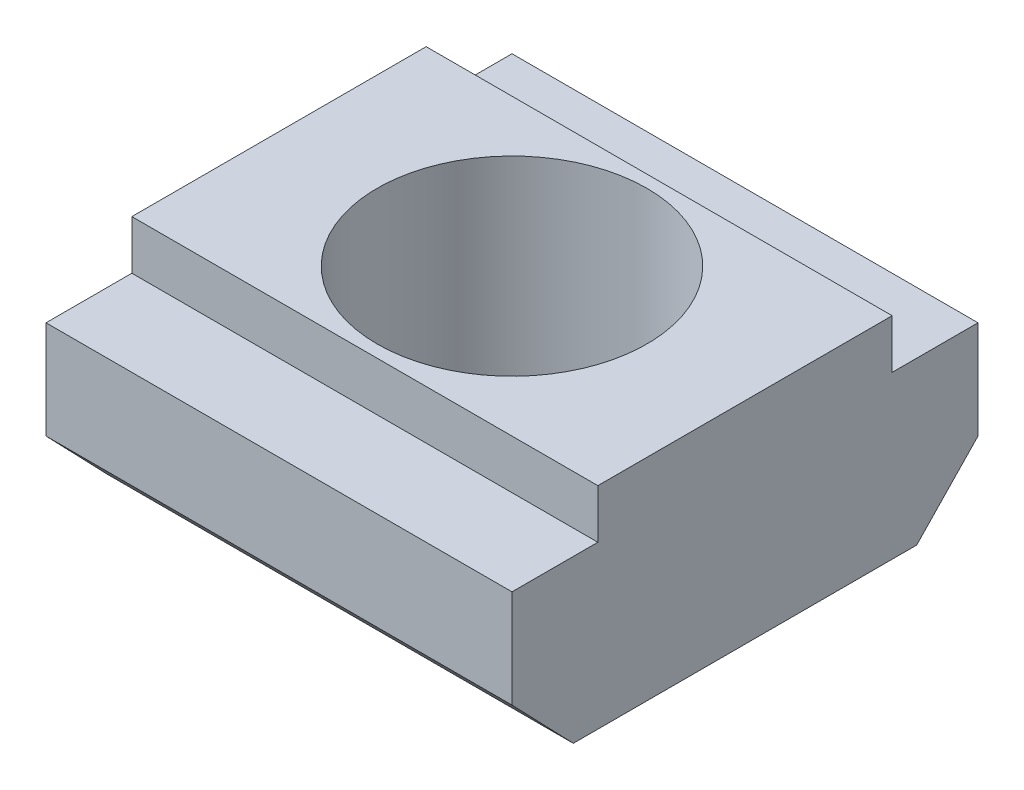
ISO-10303-21;
HEADER;
FILE_DESCRIPTION(('STEP AP214'),'2;1');
FILE_NAME('part.step','',(''),(''),'','','');
FILE_SCHEMA(('AUTOMOTIVE_DESIGN { 1 0 10303 214 1 1 1 1 }'));
ENDSEC;
DATA;
#1=APPLICATION_CONTEXT('core data for automotive mechanical design processes');
#2=APPLICATION_PROTOCOL_DEFINITION('international standard','automotive_design',2000,#1);
#3=PRODUCT_CONTEXT('',#1,'mechanical');
#4=PRODUCT('Part','Part','',(#3));
#5=PRODUCT_RELATED_PRODUCT_CATEGORY('part','',(#4));
#6=PRODUCT_DEFINITION_FORMATION('','',#4);
#7=PRODUCT_DEFINITION_CONTEXT('part definition',#1,'design');
#8=PRODUCT_DEFINITION('design','',#6,#7);
#9=PRODUCT_DEFINITION_SHAPE('','',#8);
#10=(LENGTH_UNIT() NAMED_UNIT(*) SI_UNIT(.MILLI.,.METRE.));
#11=(NAMED_UNIT(*) PLANE_ANGLE_UNIT() SI_UNIT($,.RADIAN.));
#12=(NAMED_UNIT(*) SI_UNIT($,.STERADIAN.) SOLID_ANGLE_UNIT());
#13=UNCERTAINTY_MEASURE_WITH_UNIT(LENGTH_MEASURE(1.E-05),#10,'distance_accuracy_value','');
#14=(GEOMETRIC_REPRESENTATION_CONTEXT(3) GLOBAL_UNCERTAINTY_ASSIGNED_CONTEXT((#13)) GLOBAL_UNIT_ASSIGNED_CONTEXT((#10,
#11,#12)) REPRESENTATION_CONTEXT('',''));
#15=CARTESIAN_POINT('',(0.,0.,0.));
#16=DIRECTION('',(0.,0.,1.));
#17=DIRECTION('',(1.,0.,0.));
#18=AXIS2_PLACEMENT_3D('',#15,#16,#17);
#19=CARTESIAN_POINT('',(4.75,0.,-3.5));
#20=DIRECTION('',(0.,0.693108716251784,0.720833064901856));
#21=DIRECTION('',(0.,-0.720833064901856,0.693108716251784));
#22=AXIS2_PLACEMENT_3D('',#19,#20,#21);
#23=PLANE('',#22);
#24=DIRECTION('',(0.,0.720833064901856,-0.693108716251784));
#25=VECTOR('',#24,1.);
#26=CARTESIAN_POINT('',(-4.75,0.,-3.5));
#27=LINE('',#26,#25);
#28=CARTESIAN_POINT('',(-4.75,0.,-3.5));
#29=VERTEX_POINT('',#28);
#30=CARTESIAN_POINT('',(-4.75,1.3,-4.75));
#31=VERTEX_POINT('',#30);
#32=EDGE_CURVE('E141',#29,#31,#27,.T.);
#33=ORIENTED_EDGE('',*,*,#32,.T.);
#34=DIRECTION('',(-1.,0.,0.));
#35=VECTOR('',#34,1.);
#36=CARTESIAN_POINT('',(4.75,1.3,-4.75));
#37=LINE('',#36,#35);
#38=CARTESIAN_POINT('',(4.75,1.3,-4.75));
#39=VERTEX_POINT('',#38);
#40=EDGE_CURVE('E11',#39,#31,#37,.T.);
#41=ORIENTED_EDGE('',*,*,#40,.F.);
#42=DIRECTION('',(0.,0.720833064901856,-0.693108716251784));
#43=VECTOR('',#42,1.);
#44=CARTESIAN_POINT('',(4.75,0.,-3.5));
#45=LINE('',#44,#43);
#46=CARTESIAN_POINT('',(4.75,0.,-3.5));
#47=VERTEX_POINT('',#46);
#48=EDGE_CURVE('E160',#47,#39,#45,.T.);
#49=ORIENTED_EDGE('',*,*,#48,.F.);
#50=DIRECTION('',(-1.,0.,0.));
#51=VECTOR('',#50,1.);
#52=CARTESIAN_POINT('',(4.75,0.,-3.5));
#53=LINE('',#52,#51);
#54=EDGE_CURVE('E137',#47,#29,#53,.T.);
#55=ORIENTED_EDGE('',*,*,#54,.T.);
#56=EDGE_LOOP('',(#33,#41,#49,#55));
#57=FACE_BOUND('',#56,.T.);
#58=ADVANCED_FACE('F33',(#57),#23,.F.);
#59=CARTESIAN_POINT('',(4.75,1.3,-4.75));
#60=DIRECTION('',(0.,0.,1.));
#61=DIRECTION('',(0.,-1.,0.));
#62=AXIS2_PLACEMENT_3D('',#59,#60,#61);
#63=PLANE('',#62);
#64=DIRECTION('',(0.,1.,0.));
#65=VECTOR('',#64,1.);
#66=CARTESIAN_POINT('',(-4.75,1.3,-4.75));
#67=LINE('',#66,#65);
#68=CARTESIAN_POINT('',(-4.75,3.3,-4.75));
#69=VERTEX_POINT('',#68);
#70=EDGE_CURVE('E144',#31,#69,#67,.T.);
#71=ORIENTED_EDGE('',*,*,#70,.T.);
#72=DIRECTION('',(-1.,0.,0.));
#73=VECTOR('',#72,1.);
#74=CARTESIAN_POINT('',(4.75,3.3,-4.75));
#75=LINE('',#74,#73);
#76=CARTESIAN_POINT('',(4.75,3.3,-4.75));
#77=VERTEX_POINT('',#76);
#78=EDGE_CURVE('E41',#77,#69,#75,.T.);
#79=ORIENTED_EDGE('',*,*,#78,.F.);
#80=DIRECTION('',(0.,1.,0.));
#81=VECTOR('',#80,1.);
#82=CARTESIAN_POINT('',(4.75,1.3,-4.75));
#83=LINE('',#82,#81);
#84=EDGE_CURVE('E98',#39,#77,#83,.T.);
#85=ORIENTED_EDGE('',*,*,#84,.F.);
#86=ORIENTED_EDGE('',*,*,#40,.T.);
#87=EDGE_LOOP('',(#71,#79,#85,#86));
#88=FACE_BOUND('',#87,.T.);
#89=ADVANCED_FACE('F227',(#88),#63,.F.);
#90=CARTESIAN_POINT('',(4.75,3.3,-4.75));
#91=DIRECTION('',(0.,-1.,0.));
#92=DIRECTION('',(0.,0.,-1.));
#93=AXIS2_PLACEMENT_3D('',#90,#91,#92);
#94=PLANE('',#93);
#95=DIRECTION('',(0.,0.,1.));
#96=VECTOR('',#95,1.);
#97=CARTESIAN_POINT('',(-4.75,3.3,-4.75));
#98=LINE('',#97,#96);
#99=CARTESIAN_POINT('',(-4.75,3.3,-3.));
#100=VERTEX_POINT('',#99);
#101=EDGE_CURVE('E147',#69,#100,#98,.T.);
#102=ORIENTED_EDGE('',*,*,#101,.T.);
#103=DIRECTION('',(-1.,0.,0.));
#104=VECTOR('',#103,1.);
#105=CARTESIAN_POINT('',(4.75,3.3,-3.));
#106=LINE('',#105,#104);
#107=CARTESIAN_POINT('',(4.75,3.3,-3.));
#108=VERTEX_POINT('',#107);
#109=EDGE_CURVE('E173',#108,#100,#106,.T.);
#110=ORIENTED_EDGE('',*,*,#109,.F.);
#111=DIRECTION('',(0.,0.,1.));
#112=VECTOR('',#111,1.);
#113=CARTESIAN_POINT('',(4.75,3.3,-4.75));
#114=LINE('',#113,#112);
#115=EDGE_CURVE('E181',#77,#108,#114,.T.);
#116=ORIENTED_EDGE('',*,*,#115,.F.);
#117=ORIENTED_EDGE('',*,*,#78,.T.);
#118=EDGE_LOOP('',(#102,#110,#116,#117));
#119=FACE_BOUND('',#118,.T.);
#120=ADVANCED_FACE('F179',(#119),#94,.F.);
#121=CARTESIAN_POINT('',(4.75,3.3,-3.));
#122=DIRECTION('',(0.,0.,1.));
#123=DIRECTION('',(1.,0.,0.));
#124=AXIS2_PLACEMENT_3D('',#121,#122,#123);
#125=PLANE('',#124);
#126=DIRECTION('',(0.,1.,0.));
#127=VECTOR('',#126,1.);
#128=CARTESIAN_POINT('',(-4.75,3.3,-3.));
#129=LINE('',#128,#127);
#130=CARTESIAN_POINT('',(-4.75,4.3,-3.));
#131=VERTEX_POINT('',#130);
#132=EDGE_CURVE('E149',#100,#131,#129,.T.);
#133=ORIENTED_EDGE('',*,*,#132,.T.);
#134=DIRECTION('',(-1.,0.,0.));
#135=VECTOR('',#134,1.);
#136=CARTESIAN_POINT('',(4.75,4.3,-3.));
#137=LINE('',#136,#135);
#138=CARTESIAN_POINT('',(4.75,4.3,-3.));
#139=VERTEX_POINT('',#138);
#140=EDGE_CURVE('E170',#139,#131,#137,.T.);
#141=ORIENTED_EDGE('',*,*,#140,.F.);
#142=DIRECTION('',(0.,1.,0.));
#143=VECTOR('',#142,1.);
#144=CARTESIAN_POINT('',(4.75,3.3,-3.));
#145=LINE('',#144,#143);
#146=EDGE_CURVE('E199',#108,#139,#145,.T.);
#147=ORIENTED_EDGE('',*,*,#146,.F.);
#148=ORIENTED_EDGE('',*,*,#109,.T.);
#149=EDGE_LOOP('',(#133,#141,#147,#148));
#150=FACE_BOUND('',#149,.T.);
#151=ADVANCED_FACE('F190',(#150),#125,.F.);
#152=CARTESIAN_POINT('',(4.75,4.3,-3.));
#153=DIRECTION('',(0.,-1.,0.));
#154=DIRECTION('',(0.,0.,-1.));
#155=AXIS2_PLACEMENT_3D('',#152,#153,#154);
#156=PLANE('',#155);
#157=CARTESIAN_POINT('',(0.,4.3,0.));
#158=DIRECTION('',(0.,1.,0.));
#159=DIRECTION('',(0.,0.,1.));
#160=AXIS2_PLACEMENT_3D('',#157,#158,#159);
#161=CIRCLE('',#160,2.75);
#162=CARTESIAN_POINT('',(0.,4.3,2.75));
#163=VERTEX_POINT('',#162);
#164=EDGE_CURVE('E209',#163,#163,#161,.T.);
#165=ORIENTED_EDGE('',*,*,#164,.F.);
#166=EDGE_LOOP('',(#165));
#167=FACE_BOUND('',#166,.T.);
#168=DIRECTION('',(0.,0.,1.));
#169=VECTOR('',#168,1.);
#170=CARTESIAN_POINT('',(-4.75,4.3,-3.));
#171=LINE('',#170,#169);
#172=CARTESIAN_POINT('',(-4.75,4.3,3.));
#173=VERTEX_POINT('',#172);
#174=EDGE_CURVE('E151',#131,#173,#171,.T.);
#175=ORIENTED_EDGE('',*,*,#174,.T.);
#176=DIRECTION('',(-1.,0.,0.));
#177=VECTOR('',#176,1.);
#178=CARTESIAN_POINT('',(4.75,4.3,3.));
#179=LINE('',#178,#177);
#180=CARTESIAN_POINT('',(4.75,4.3,3.));
#181=VERTEX_POINT('',#180);
#182=EDGE_CURVE('E167',#181,#173,#179,.T.);
#183=ORIENTED_EDGE('',*,*,#182,.F.);
#184=DIRECTION('',(0.,0.,1.));
#185=VECTOR('',#184,1.);
#186=CARTESIAN_POINT('',(4.75,4.3,-3.));
#187=LINE('',#186,#185);
#188=EDGE_CURVE('E196',#139,#181,#187,.T.);
#189=ORIENTED_EDGE('',*,*,#188,.F.);
#190=ORIENTED_EDGE('',*,*,#140,.T.);
#191=EDGE_LOOP('',(#175,#183,#189,#190));
#192=FACE_BOUND('',#191,.T.);
#193=ADVANCED_FACE('F194',(#167,#192),#156,.F.);
#194=CARTESIAN_POINT('',(4.75,3.3,3.));
#195=DIRECTION('',(0.,0.,-1.));
#196=DIRECTION('',(-1.,0.,0.));
#197=AXIS2_PLACEMENT_3D('',#194,#195,#196);
#198=PLANE('',#197);
#199=DIRECTION('',(0.,-1.,0.));
#200=VECTOR('',#199,1.);
#201=CARTESIAN_POINT('',(-4.75,3.3,3.));
#202=LINE('',#201,#200);
#203=CARTESIAN_POINT('',(-4.75,3.3,3.));
#204=VERTEX_POINT('',#203);
#205=EDGE_CURVE('E153',#173,#204,#202,.T.);
#206=ORIENTED_EDGE('',*,*,#205,.T.);
#207=DIRECTION('',(-1.,0.,0.));
#208=VECTOR('',#207,1.);
#209=CARTESIAN_POINT('',(4.75,3.3,3.));
#210=LINE('',#209,#208);
#211=CARTESIAN_POINT('',(4.75,3.3,3.));
#212=VERTEX_POINT('',#211);
#213=EDGE_CURVE('E164',#212,#204,#210,.T.);
#214=ORIENTED_EDGE('',*,*,#213,.F.);
#215=DIRECTION('',(0.,-1.,0.));
#216=VECTOR('',#215,1.);
#217=CARTESIAN_POINT('',(4.75,3.3,3.));
#218=LINE('',#217,#216);
#219=EDGE_CURVE('E198',#181,#212,#218,.T.);
#220=ORIENTED_EDGE('',*,*,#219,.F.);
#221=ORIENTED_EDGE('',*,*,#182,.T.);
#222=EDGE_LOOP('',(#206,#214,#220,#221));
#223=FACE_BOUND('',#222,.T.);
#224=ADVANCED_FACE('F216',(#223),#198,.F.);
#225=CARTESIAN_POINT('',(4.75,3.3,4.75));
#226=DIRECTION('',(0.,-1.,0.));
#227=DIRECTION('',(0.,0.,-1.));
#228=AXIS2_PLACEMENT_3D('',#225,#226,#227);
#229=PLANE('',#228);
#230=DIRECTION('',(0.,0.,1.));
#231=VECTOR('',#230,1.);
#232=CARTESIAN_POINT('',(-4.75,3.3,4.75));
#233=LINE('',#232,#231);
#234=CARTESIAN_POINT('',(-4.75,3.3,4.75));
#235=VERTEX_POINT('',#234);
#236=EDGE_CURVE('E155',#204,#235,#233,.T.);
#237=ORIENTED_EDGE('',*,*,#236,.T.);
#238=DIRECTION('',(-1.,0.,0.));
#239=VECTOR('',#238,1.);
#240=CARTESIAN_POINT('',(4.75,3.3,4.75));
#241=LINE('',#240,#239);
#242=CARTESIAN_POINT('',(4.75,3.3,4.75));
#243=VERTEX_POINT('',#242);
#244=EDGE_CURVE('E132',#243,#235,#241,.T.);
#245=ORIENTED_EDGE('',*,*,#244,.F.);
#246=DIRECTION('',(0.,0.,1.));
#247=VECTOR('',#246,1.);
#248=CARTESIAN_POINT('',(4.75,3.3,4.75));
#249=LINE('',#248,#247);
#250=EDGE_CURVE('E123',#212,#243,#249,.T.);
#251=ORIENTED_EDGE('',*,*,#250,.F.);
#252=ORIENTED_EDGE('',*,*,#213,.T.);
#253=EDGE_LOOP('',(#237,#245,#251,#252));
#254=FACE_BOUND('',#253,.T.);
#255=ADVANCED_FACE('F222',(#254),#229,.F.);
#256=CARTESIAN_POINT('',(4.75,1.3,4.75));
#257=DIRECTION('',(0.,0.,-1.));
#258=DIRECTION('',(0.,1.,0.));
#259=AXIS2_PLACEMENT_3D('',#256,#257,#258);
#260=PLANE('',#259);
#261=DIRECTION('',(0.,-1.,0.));
#262=VECTOR('',#261,1.);
#263=CARTESIAN_POINT('',(-4.75,1.3,4.75));
#264=LINE('',#263,#262);
#265=CARTESIAN_POINT('',(-4.75,1.3,4.75));
#266=VERTEX_POINT('',#265);
#267=EDGE_CURVE('E131',#235,#266,#264,.T.);
#268=ORIENTED_EDGE('',*,*,#267,.T.);
#269=DIRECTION('',(-1.,0.,0.));
#270=VECTOR('',#269,1.);
#271=CARTESIAN_POINT('',(4.75,1.3,4.75));
#272=LINE('',#271,#270);
#273=CARTESIAN_POINT('',(4.75,1.3,4.75));
#274=VERTEX_POINT('',#273);
#275=EDGE_CURVE('E128',#274,#266,#272,.T.);
#276=ORIENTED_EDGE('',*,*,#275,.F.);
#277=DIRECTION('',(0.,-1.,0.));
#278=VECTOR('',#277,1.);
#279=CARTESIAN_POINT('',(4.75,1.3,4.75));
#280=LINE('',#279,#278);
#281=EDGE_CURVE('E117',#243,#274,#280,.T.);
#282=ORIENTED_EDGE('',*,*,#281,.F.);
#283=ORIENTED_EDGE('',*,*,#244,.T.);
#284=EDGE_LOOP('',(#268,#276,#282,#283));
#285=FACE_BOUND('',#284,.T.);
#286=ADVANCED_FACE('F129',(#285),#260,.F.);
#287=CARTESIAN_POINT('',(4.75,0.,3.5));
#288=DIRECTION('',(0.,0.693108716251785,-0.720833064901856));
#289=DIRECTION('',(0.,0.720833064901856,0.693108716251785));
#290=AXIS2_PLACEMENT_3D('',#287,#288,#289);
#291=PLANE('',#290);
#292=DIRECTION('',(0.,-0.720833064901856,-0.693108716251785));
#293=VECTOR('',#292,1.);
#294=CARTESIAN_POINT('',(-4.75,0.,3.5));
#295=LINE('',#294,#293);
#296=CARTESIAN_POINT('',(-4.75,0.,3.5));
#297=VERTEX_POINT('',#296);
#298=EDGE_CURVE('E84',#266,#297,#295,.T.);
#299=ORIENTED_EDGE('',*,*,#298,.T.);
#300=DIRECTION('',(-1.,0.,0.));
#301=VECTOR('',#300,1.);
#302=CARTESIAN_POINT('',(4.75,0.,3.5));
#303=LINE('',#302,#301);
#304=CARTESIAN_POINT('',(4.75,0.,3.5));
#305=VERTEX_POINT('',#304);
#306=EDGE_CURVE('E133',#305,#297,#303,.T.);
#307=ORIENTED_EDGE('',*,*,#306,.F.);
#308=DIRECTION('',(0.,-0.720833064901856,-0.693108716251785));
#309=VECTOR('',#308,1.);
#310=CARTESIAN_POINT('',(4.75,0.,3.5));
#311=LINE('',#310,#309);
#312=EDGE_CURVE('E121',#274,#305,#311,.T.);
#313=ORIENTED_EDGE('',*,*,#312,.F.);
#314=ORIENTED_EDGE('',*,*,#275,.T.);
#315=EDGE_LOOP('',(#299,#307,#313,#314));
#316=FACE_BOUND('',#315,.T.);
#317=ADVANCED_FACE('F135',(#316),#291,.F.);
#318=CARTESIAN_POINT('',(4.75,0.,3.5));
#319=DIRECTION('',(0.,1.,0.));
#320=DIRECTION('',(0.,0.,1.));
#321=AXIS2_PLACEMENT_3D('',#318,#319,#320);
#322=PLANE('',#321);
#323=CARTESIAN_POINT('',(0.,0.,0.));
#324=DIRECTION('',(0.,1.,0.));
#325=DIRECTION('',(0.,0.,1.));
#326=AXIS2_PLACEMENT_3D('',#323,#324,#325);
#327=CIRCLE('',#326,2.75);
#328=CARTESIAN_POINT('',(0.,0.,2.75));
#329=VERTEX_POINT('',#328);
#330=EDGE_CURVE('E145',#329,#329,#327,.T.);
#331=ORIENTED_EDGE('',*,*,#330,.T.);
#332=EDGE_LOOP('',(#331));
#333=FACE_BOUND('',#332,.T.);
#334=DIRECTION('',(0.,0.,-1.));
#335=VECTOR('',#334,1.);
#336=CARTESIAN_POINT('',(-4.75,0.,3.5));
#337=LINE('',#336,#335);
#338=EDGE_CURVE('E90',#297,#29,#337,.T.);
#339=ORIENTED_EDGE('',*,*,#338,.T.);
#340=ORIENTED_EDGE('',*,*,#54,.F.);
#341=DIRECTION('',(0.,0.,-1.));
#342=VECTOR('',#341,1.);
#343=CARTESIAN_POINT('',(4.75,0.,3.5));
#344=LINE('',#343,#342);
#345=EDGE_CURVE('E49',#305,#47,#344,.T.);
#346=ORIENTED_EDGE('',*,*,#345,.F.);
#347=ORIENTED_EDGE('',*,*,#306,.T.);
#348=EDGE_LOOP('',(#339,#340,#346,#347));
#349=FACE_BOUND('',#348,.T.);
#350=ADVANCED_FACE('F246',(#333,#349),#322,.F.);
#351=CARTESIAN_POINT('',(4.75,0.,0.));
#352=DIRECTION('',(1.,0.,0.));
#353=DIRECTION('',(0.,0.,-1.));
#354=AXIS2_PLACEMENT_3D('',#351,#352,#353);
#355=PLANE('',#354);
#356=ORIENTED_EDGE('',*,*,#48,.T.);
#357=ORIENTED_EDGE('',*,*,#84,.T.);
#358=ORIENTED_EDGE('',*,*,#115,.T.);
#359=ORIENTED_EDGE('',*,*,#146,.T.);
#360=ORIENTED_EDGE('',*,*,#188,.T.);
#361=ORIENTED_EDGE('',*,*,#219,.T.);
#362=ORIENTED_EDGE('',*,*,#250,.T.);
#363=ORIENTED_EDGE('',*,*,#281,.T.);
#364=ORIENTED_EDGE('',*,*,#312,.T.);
#365=ORIENTED_EDGE('',*,*,#345,.T.);
#366=EDGE_LOOP('',(#356,#357,#358,#359,#360,#361,#362,#363,#364,#365));
#367=FACE_BOUND('',#366,.T.);
#368=ADVANCED_FACE('F119',(#367),#355,.T.);
#369=CARTESIAN_POINT('',(-4.75,0.,0.));
#370=DIRECTION('',(1.,0.,0.));
#371=DIRECTION('',(0.,0.,-1.));
#372=AXIS2_PLACEMENT_3D('',#369,#370,#371);
#373=PLANE('',#372);
#374=ORIENTED_EDGE('',*,*,#32,.F.);
#375=ORIENTED_EDGE('',*,*,#338,.F.);
#376=ORIENTED_EDGE('',*,*,#298,.F.);
#377=ORIENTED_EDGE('',*,*,#267,.F.);
#378=ORIENTED_EDGE('',*,*,#236,.F.);
#379=ORIENTED_EDGE('',*,*,#205,.F.);
#380=ORIENTED_EDGE('',*,*,#174,.F.);
#381=ORIENTED_EDGE('',*,*,#132,.F.);
#382=ORIENTED_EDGE('',*,*,#101,.F.);
#383=ORIENTED_EDGE('',*,*,#70,.F.);
#384=EDGE_LOOP('',(#374,#375,#376,#377,#378,#379,#380,#381,#382,#383));
#385=FACE_BOUND('',#384,.T.);
#386=ADVANCED_FACE('F185',(#385),#373,.F.);
#387=CARTESIAN_POINT('',(0.,4.3,0.));
#388=DIRECTION('',(0.,1.,0.));
#389=DIRECTION('',(0.,0.,1.));
#390=AXIS2_PLACEMENT_3D('',#387,#388,#389);
#391=CYLINDRICAL_SURFACE('',#390,2.75);
#392=ORIENTED_EDGE('',*,*,#330,.F.);
#393=EDGE_LOOP('',(#392));
#394=FACE_BOUND('',#393,.T.);
#395=ORIENTED_EDGE('',*,*,#164,.T.);
#396=EDGE_LOOP('',(#395));
#397=FACE_BOUND('',#396,.T.);
#398=ADVANCED_FACE('F213',(#394,#397),#391,.F.);
#399=CLOSED_SHELL('',(#58,#89,#120,#151,#193,#224,#255,#286,#317,#350,#368,#386,#398));
#400=MANIFOLD_SOLID_BREP('B2',#399);
#401=ADVANCED_BREP_SHAPE_REPRESENTATION('',(#18,#400),#14);
#402=SHAPE_DEFINITION_REPRESENTATION(#9,#401);
ENDSEC;
END-ISO-10303-21;
